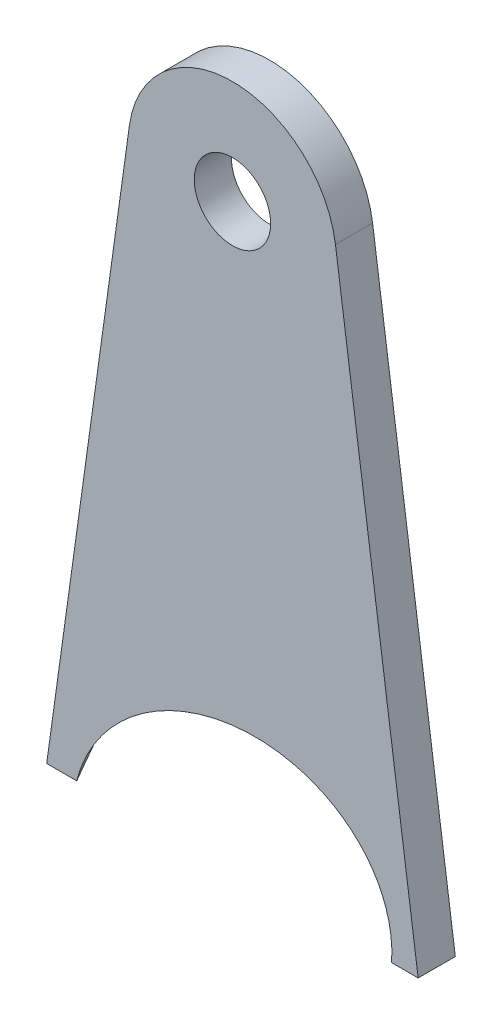
ISO-10303-21;
HEADER;
FILE_DESCRIPTION(('STEP AP214'),'2;1');
FILE_NAME('part.step','',(''),(''),'','','');
FILE_SCHEMA(('AUTOMOTIVE_DESIGN { 1 0 10303 214 1 1 1 1 }'));
ENDSEC;
DATA;
#1=APPLICATION_CONTEXT('core data for automotive mechanical design processes');
#2=APPLICATION_PROTOCOL_DEFINITION('international standard','automotive_design',2000,#1);
#3=PRODUCT_CONTEXT('',#1,'mechanical');
#4=PRODUCT('Part','Part','',(#3));
#5=PRODUCT_RELATED_PRODUCT_CATEGORY('part','',(#4));
#6=PRODUCT_DEFINITION_FORMATION('','',#4);
#7=PRODUCT_DEFINITION_CONTEXT('part definition',#1,'design');
#8=PRODUCT_DEFINITION('design','',#6,#7);
#9=PRODUCT_DEFINITION_SHAPE('','',#8);
#10=(LENGTH_UNIT() NAMED_UNIT(*) SI_UNIT(.MILLI.,.METRE.));
#11=(NAMED_UNIT(*) PLANE_ANGLE_UNIT() SI_UNIT($,.RADIAN.));
#12=(NAMED_UNIT(*) SI_UNIT($,.STERADIAN.) SOLID_ANGLE_UNIT());
#13=UNCERTAINTY_MEASURE_WITH_UNIT(LENGTH_MEASURE(1.E-05),#10,'distance_accuracy_value','');
#14=(GEOMETRIC_REPRESENTATION_CONTEXT(3) GLOBAL_UNCERTAINTY_ASSIGNED_CONTEXT((#13)) GLOBAL_UNIT_ASSIGNED_CONTEXT((#10,
#11,#12)) REPRESENTATION_CONTEXT('',''));
#15=CARTESIAN_POINT('',(0.,0.,0.));
#16=DIRECTION('',(0.,0.,1.));
#17=DIRECTION('',(1.,0.,0.));
#18=AXIS2_PLACEMENT_3D('',#15,#16,#17);
#19=CARTESIAN_POINT('',(0.,-49.53,-3.175));
#20=DIRECTION('',(0.,1.,0.));
#21=DIRECTION('',(-1.,0.,0.));
#22=AXIS2_PLACEMENT_3D('',#19,#20,#21);
#23=PLANE('',#22);
#24=CARTESIAN_POINT('',(2.29948606295052,-49.53,3.53926844532571));
#25=DIRECTION('',(0.,-1.,0.));
#26=DIRECTION('',(0.544815380436231,0.,0.838556021527558));
#27=AXIS2_PLACEMENT_3D('',#24,#25,#26);
#28=ELLIPSE('',#27,52.6907155835493,11.43);
#29=CARTESIAN_POINT('',(13.6055420477318,-49.53,0.));
#30=VERTEX_POINT('',#29);
#31=CARTESIAN_POINT('',(11.5669262911306,-49.53,-3.175));
#32=VERTEX_POINT('',#31);
#33=EDGE_CURVE('E11',#30,#32,#28,.F.);
#34=ORIENTED_EDGE('',*,*,#33,.T.);
#35=DIRECTION('',(1.,0.,0.));
#36=VECTOR('',#35,1.);
#37=CARTESIAN_POINT('',(0.,-49.53,-3.175));
#38=LINE('',#37,#36);
#39=CARTESIAN_POINT('',(15.875,-49.53,-3.175));
#40=VERTEX_POINT('',#39);
#41=EDGE_CURVE('E113',#32,#40,#38,.T.);
#42=ORIENTED_EDGE('',*,*,#41,.T.);
#43=DIRECTION('',(0.,0.,1.));
#44=VECTOR('',#43,1.);
#45=CARTESIAN_POINT('',(15.875,-49.53,-3.175));
#46=LINE('',#45,#44);
#47=CARTESIAN_POINT('',(15.875,-49.53,0.));
#48=VERTEX_POINT('',#47);
#49=EDGE_CURVE('E110',#40,#48,#46,.T.);
#50=ORIENTED_EDGE('',*,*,#49,.T.);
#51=DIRECTION('',(1.,0.,0.));
#52=VECTOR('',#51,1.);
#53=CARTESIAN_POINT('',(0.,-49.53,0.));
#54=LINE('',#53,#52);
#55=EDGE_CURVE('E102',#30,#48,#54,.T.);
#56=ORIENTED_EDGE('',*,*,#55,.F.);
#57=EDGE_LOOP('',(#34,#42,#50,#56));
#58=FACE_BOUND('',#57,.T.);
#59=ADVANCED_FACE('F43',(#58),#23,.F.);
#60=CARTESIAN_POINT('',(-8.80499106591057,1.22647149548415,-3.175));
#61=DIRECTION('',(-0.990437690203663,0.137960798142199,0.));
#62=DIRECTION('',(-0.1379607981422,-0.990437690203663,0.));
#63=AXIS2_PLACEMENT_3D('',#60,#61,#62);
#64=PLANE('',#63);
#65=DIRECTION('',(0.1379607981422,0.990437690203663,0.));
#66=VECTOR('',#65,1.);
#67=CARTESIAN_POINT('',(-8.80499106591057,1.22647149548415,0.));
#68=LINE('',#67,#66);
#69=CARTESIAN_POINT('',(-15.875,-49.53,0.));
#70=VERTEX_POINT('',#69);
#71=CARTESIAN_POINT('',(-8.80499106591057,1.22647149548415,0.));
#72=VERTEX_POINT('',#71);
#73=EDGE_CURVE('E134',#70,#72,#68,.T.);
#74=ORIENTED_EDGE('',*,*,#73,.T.);
#75=DIRECTION('',(0.,0.,1.));
#76=VECTOR('',#75,1.);
#77=CARTESIAN_POINT('',(-8.80499106591057,1.22647149548415,-3.175));
#78=LINE('',#77,#76);
#79=CARTESIAN_POINT('',(-8.80499106591057,1.22647149548415,-3.175));
#80=VERTEX_POINT('',#79);
#81=EDGE_CURVE('E138',#80,#72,#78,.T.);
#82=ORIENTED_EDGE('',*,*,#81,.F.);
#83=DIRECTION('',(0.1379607981422,0.990437690203663,0.));
#84=VECTOR('',#83,1.);
#85=CARTESIAN_POINT('',(-8.80499106591057,1.22647149548415,-3.175));
#86=LINE('',#85,#84);
#87=CARTESIAN_POINT('',(-15.875,-49.53,-3.175));
#88=VERTEX_POINT('',#87);
#89=EDGE_CURVE('E111',#88,#80,#86,.T.);
#90=ORIENTED_EDGE('',*,*,#89,.F.);
#91=DIRECTION('',(0.,0.,1.));
#92=VECTOR('',#91,1.);
#93=CARTESIAN_POINT('',(-15.875,-49.53,-3.175));
#94=LINE('',#93,#92);
#95=EDGE_CURVE('E149',#88,#70,#94,.T.);
#96=ORIENTED_EDGE('',*,*,#95,.T.);
#97=EDGE_LOOP('',(#74,#82,#90,#96));
#98=FACE_BOUND('',#97,.T.);
#99=ADVANCED_FACE('F159',(#98),#64,.T.);
#100=CARTESIAN_POINT('',(-15.1200783798455,-49.53,-3.175));
#101=VERTEX_POINT('',#100);
#102=CARTESIAN_POINT('',(-13.3037701648821,-49.53,0.));
#103=VERTEX_POINT('',#102);
#104=EDGE_CURVE('E55',#101,#103,#28,.F.);
#105=ORIENTED_EDGE('',*,*,#104,.T.);
#106=EDGE_CURVE('E47',#70,#103,#54,.T.);
#107=ORIENTED_EDGE('',*,*,#106,.F.);
#108=ORIENTED_EDGE('',*,*,#95,.F.);
#109=EDGE_CURVE('E114',#88,#101,#38,.T.);
#110=ORIENTED_EDGE('',*,*,#109,.T.);
#111=EDGE_LOOP('',(#105,#107,#108,#110));
#112=FACE_BOUND('',#111,.T.);
#113=ADVANCED_FACE('F45',(#112),#23,.F.);
#114=CARTESIAN_POINT('',(8.80499106591057,1.22647149548416,-3.175));
#115=DIRECTION('',(-0.990437690203663,-0.1379607981422,0.));
#116=DIRECTION('',(0.1379607981422,-0.990437690203663,0.));
#117=AXIS2_PLACEMENT_3D('',#114,#115,#116);
#118=PLANE('',#117);
#119=DIRECTION('',(-0.1379607981422,0.990437690203663,0.));
#120=VECTOR('',#119,1.);
#121=CARTESIAN_POINT('',(8.80499106591057,1.22647149548416,0.));
#122=LINE('',#121,#120);
#123=CARTESIAN_POINT('',(8.80499106591057,1.22647149548416,0.));
#124=VERTEX_POINT('',#123);
#125=EDGE_CURVE('E147',#48,#124,#122,.T.);
#126=ORIENTED_EDGE('',*,*,#125,.F.);
#127=ORIENTED_EDGE('',*,*,#49,.F.);
#128=DIRECTION('',(-0.1379607981422,0.990437690203663,0.));
#129=VECTOR('',#128,1.);
#130=CARTESIAN_POINT('',(8.80499106591057,1.22647149548416,-3.175));
#131=LINE('',#130,#129);
#132=CARTESIAN_POINT('',(8.80499106591057,1.22647149548416,-3.175));
#133=VERTEX_POINT('',#132);
#134=EDGE_CURVE('E119',#40,#133,#131,.T.);
#135=ORIENTED_EDGE('',*,*,#134,.T.);
#136=DIRECTION('',(0.,0.,1.));
#137=VECTOR('',#136,1.);
#138=CARTESIAN_POINT('',(8.80499106591057,1.22647149548416,-3.175));
#139=LINE('',#138,#137);
#140=EDGE_CURVE('E126',#133,#124,#139,.T.);
#141=ORIENTED_EDGE('',*,*,#140,.T.);
#142=EDGE_LOOP('',(#126,#127,#135,#141));
#143=FACE_BOUND('',#142,.T.);
#144=ADVANCED_FACE('F166',(#143),#118,.F.);
#145=CARTESIAN_POINT('',(0.,0.,-3.175));
#146=DIRECTION('',(0.,0.,1.));
#147=DIRECTION('',(-1.,0.,0.));
#148=AXIS2_PLACEMENT_3D('',#145,#146,#147);
#149=CYLINDRICAL_SURFACE('',#148,8.89);
#150=CARTESIAN_POINT('',(0.,0.,0.));
#151=DIRECTION('',(0.,0.,1.));
#152=DIRECTION('',(1.,0.,0.));
#153=AXIS2_PLACEMENT_3D('',#150,#151,#152);
#154=CIRCLE('',#153,8.89);
#155=EDGE_CURVE('E130',#124,#72,#154,.T.);
#156=ORIENTED_EDGE('',*,*,#155,.F.);
#157=ORIENTED_EDGE('',*,*,#140,.F.);
#158=CARTESIAN_POINT('',(0.,0.,-3.175));
#159=DIRECTION('',(0.,0.,1.));
#160=DIRECTION('',(1.,0.,0.));
#161=AXIS2_PLACEMENT_3D('',#158,#159,#160);
#162=CIRCLE('',#161,8.89);
#163=EDGE_CURVE('E120',#133,#80,#162,.T.);
#164=ORIENTED_EDGE('',*,*,#163,.T.);
#165=ORIENTED_EDGE('',*,*,#81,.T.);
#166=EDGE_LOOP('',(#156,#157,#164,#165));
#167=FACE_BOUND('',#166,.T.);
#168=ADVANCED_FACE('F157',(#167),#149,.T.);
#169=CARTESIAN_POINT('',(0.,0.,-3.175));
#170=DIRECTION('',(0.,0.,1.));
#171=DIRECTION('',(-1.,0.,0.));
#172=AXIS2_PLACEMENT_3D('',#169,#170,#171);
#173=CYLINDRICAL_SURFACE('',#172,3.2639);
#174=CARTESIAN_POINT('',(0.,0.,-3.175));
#175=DIRECTION('',(0.,0.,1.));
#176=DIRECTION('',(1.,0.,0.));
#177=AXIS2_PLACEMENT_3D('',#174,#175,#176);
#178=CIRCLE('',#177,3.2639);
#179=CARTESIAN_POINT('',(3.2639,0.,-3.175));
#180=VERTEX_POINT('',#179);
#181=EDGE_CURVE('E122',#180,#180,#178,.T.);
#182=ORIENTED_EDGE('',*,*,#181,.F.);
#183=EDGE_LOOP('',(#182));
#184=FACE_BOUND('',#183,.T.);
#185=CARTESIAN_POINT('',(0.,0.,0.));
#186=DIRECTION('',(0.,0.,1.));
#187=DIRECTION('',(1.,0.,0.));
#188=AXIS2_PLACEMENT_3D('',#185,#186,#187);
#189=CIRCLE('',#188,3.2639);
#190=CARTESIAN_POINT('',(3.2639,0.,0.));
#191=VERTEX_POINT('',#190);
#192=EDGE_CURVE('E139',#191,#191,#189,.T.);
#193=ORIENTED_EDGE('',*,*,#192,.T.);
#194=EDGE_LOOP('',(#193));
#195=FACE_BOUND('',#194,.T.);
#196=ADVANCED_FACE('F173',(#184,#195),#173,.F.);
#197=CARTESIAN_POINT('',(0.,0.,-3.175));
#198=DIRECTION('',(0.,0.,-1.));
#199=DIRECTION('',(1.,0.,0.));
#200=AXIS2_PLACEMENT_3D('',#197,#198,#199);
#201=PLANE('',#200);
#202=ORIENTED_EDGE('',*,*,#109,.F.);
#203=ORIENTED_EDGE('',*,*,#89,.T.);
#204=ORIENTED_EDGE('',*,*,#163,.F.);
#205=ORIENTED_EDGE('',*,*,#134,.F.);
#206=ORIENTED_EDGE('',*,*,#41,.F.);
#207=CARTESIAN_POINT('',(-2.06281845038114,-51.30928407364,-3.17500000000001));
#208=DIRECTION('',(0.,0.,1.));
#209=DIRECTION('',(0.925940325935367,0.377669846303231,0.));
#210=AXIS2_PLACEMENT_3D('',#207,#208,#209);
#211=ELLIPSE('',#210,13.9630626672029,11.43);
#212=EDGE_CURVE('E62',#101,#32,#211,.F.);
#213=ORIENTED_EDGE('',*,*,#212,.F.);
#214=EDGE_LOOP('',(#202,#203,#204,#205,#206,#213));
#215=FACE_BOUND('',#214,.T.);
#216=ORIENTED_EDGE('',*,*,#181,.T.);
#217=EDGE_LOOP('',(#216));
#218=FACE_BOUND('',#217,.T.);
#219=ADVANCED_FACE('F116',(#215,#218),#201,.T.);
#220=CARTESIAN_POINT('',(0.,0.,0.));
#221=DIRECTION('',(0.,0.,-1.));
#222=DIRECTION('',(1.,0.,0.));
#223=AXIS2_PLACEMENT_3D('',#220,#221,#222);
#224=PLANE('',#223);
#225=CARTESIAN_POINT('',(-2.4980018054066E-13,-50.4679076854588,0.));
#226=DIRECTION('',(0.,0.,1.));
#227=DIRECTION('',(0.925940325935367,0.377669846303231,0.));
#228=AXIS2_PLACEMENT_3D('',#225,#226,#227);
#229=ELLIPSE('',#228,13.9630626672029,11.43);
#230=EDGE_CURVE('E53',#103,#30,#229,.F.);
#231=ORIENTED_EDGE('',*,*,#230,.T.);
#232=ORIENTED_EDGE('',*,*,#55,.T.);
#233=ORIENTED_EDGE('',*,*,#125,.T.);
#234=ORIENTED_EDGE('',*,*,#155,.T.);
#235=ORIENTED_EDGE('',*,*,#73,.F.);
#236=ORIENTED_EDGE('',*,*,#106,.T.);
#237=EDGE_LOOP('',(#231,#232,#233,#234,#235,#236));
#238=FACE_BOUND('',#237,.T.);
#239=ORIENTED_EDGE('',*,*,#192,.F.);
#240=EDGE_LOOP('',(#239));
#241=FACE_BOUND('',#240,.T.);
#242=ADVANCED_FACE('F99',(#238,#241),#224,.F.);
#243=CARTESIAN_POINT('',(-123.025911317866,-100.647358474361,-189.356105653458));
#244=DIRECTION('',(0.531842232493453,0.216926262500193,0.818588319226507));
#245=DIRECTION('',(0.455152304592376,0.74192435650579,-0.492325734496702));
#246=AXIS2_PLACEMENT_3D('',#243,#244,#245);
#247=CYLINDRICAL_SURFACE('',#246,11.43);
#248=ORIENTED_EDGE('',*,*,#104,.F.);
#249=ORIENTED_EDGE('',*,*,#212,.T.);
#250=ORIENTED_EDGE('',*,*,#33,.F.);
#251=ORIENTED_EDGE('',*,*,#230,.F.);
#252=EDGE_LOOP('',(#248,#249,#250,#251));
#253=FACE_BOUND('',#252,.T.);
#254=ADVANCED_FACE('F112',(#253),#247,.F.);
#255=CLOSED_SHELL('',(#59,#99,#113,#144,#168,#196,#219,#242,#254));
#256=MANIFOLD_SOLID_BREP('B2',#255);
#257=ADVANCED_BREP_SHAPE_REPRESENTATION('',(#18,#256),#14);
#258=SHAPE_DEFINITION_REPRESENTATION(#9,#257);
ENDSEC;
END-ISO-10303-21;
